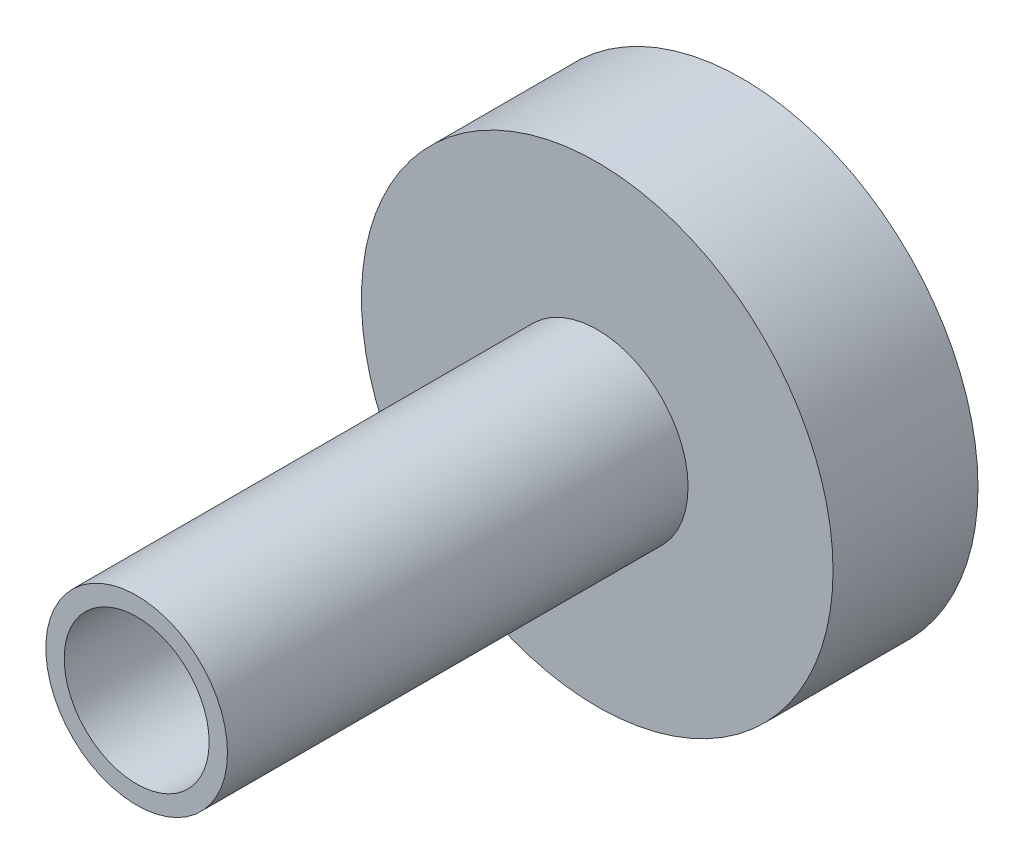
ISO-10303-21;
HEADER;
FILE_DESCRIPTION(('STEP AP214'),'2;1');
FILE_NAME('part.step','',(''),(''),'','','');
FILE_SCHEMA(('AUTOMOTIVE_DESIGN { 1 0 10303 214 1 1 1 1 }'));
ENDSEC;
DATA;
#1=APPLICATION_CONTEXT('core data for automotive mechanical design processes');
#2=APPLICATION_PROTOCOL_DEFINITION('international standard','automotive_design',2000,#1);
#3=PRODUCT_CONTEXT('',#1,'mechanical');
#4=PRODUCT('Part','Part','',(#3));
#5=PRODUCT_RELATED_PRODUCT_CATEGORY('part','',(#4));
#6=PRODUCT_DEFINITION_FORMATION('','',#4);
#7=PRODUCT_DEFINITION_CONTEXT('part definition',#1,'design');
#8=PRODUCT_DEFINITION('design','',#6,#7);
#9=PRODUCT_DEFINITION_SHAPE('','',#8);
#10=(LENGTH_UNIT() NAMED_UNIT(*) SI_UNIT(.MILLI.,.METRE.));
#11=(NAMED_UNIT(*) PLANE_ANGLE_UNIT() SI_UNIT($,.RADIAN.));
#12=(NAMED_UNIT(*) SI_UNIT($,.STERADIAN.) SOLID_ANGLE_UNIT());
#13=UNCERTAINTY_MEASURE_WITH_UNIT(LENGTH_MEASURE(1.E-05),#10,'distance_accuracy_value','');
#14=(GEOMETRIC_REPRESENTATION_CONTEXT(3) GLOBAL_UNCERTAINTY_ASSIGNED_CONTEXT((#13)) GLOBAL_UNIT_ASSIGNED_CONTEXT((#10,
#11,#12)) REPRESENTATION_CONTEXT('',''));
#15=CARTESIAN_POINT('',(0.,0.,0.));
#16=DIRECTION('',(0.,0.,1.));
#17=DIRECTION('',(1.,0.,0.));
#18=AXIS2_PLACEMENT_3D('',#15,#16,#17);
#19=CARTESIAN_POINT('',(0.,0.,33.));
#20=DIRECTION('',(0.,0.,1.));
#21=DIRECTION('',(1.,0.,0.));
#22=AXIS2_PLACEMENT_3D('',#19,#20,#21);
#23=PLANE('',#22);
#24=CARTESIAN_POINT('',(0.,0.,33.));
#25=DIRECTION('',(0.,0.,1.));
#26=DIRECTION('',(1.,0.,0.));
#27=AXIS2_PLACEMENT_3D('',#24,#25,#26);
#28=CIRCLE('',#27,3.95);
#29=CARTESIAN_POINT('',(3.95,0.,33.));
#30=VERTEX_POINT('',#29);
#31=EDGE_CURVE('E38',#30,#30,#28,.T.);
#32=ORIENTED_EDGE('',*,*,#31,.F.);
#33=EDGE_LOOP('',(#32));
#34=FACE_BOUND('',#33,.T.);
#35=CARTESIAN_POINT('',(0.,0.,33.));
#36=DIRECTION('',(0.,0.,1.));
#37=DIRECTION('',(1.,0.,0.));
#38=AXIS2_PLACEMENT_3D('',#35,#36,#37);
#39=CIRCLE('',#38,4.95);
#40=CARTESIAN_POINT('',(4.95,0.,33.));
#41=VERTEX_POINT('',#40);
#42=EDGE_CURVE('E52',#41,#41,#39,.T.);
#43=ORIENTED_EDGE('',*,*,#42,.T.);
#44=EDGE_LOOP('',(#43));
#45=FACE_BOUND('',#44,.T.);
#46=ADVANCED_FACE('F31',(#34,#45),#23,.T.);
#47=CARTESIAN_POINT('',(0.,0.,33.));
#48=DIRECTION('',(0.,0.,-1.));
#49=DIRECTION('',(-1.,0.,0.));
#50=AXIS2_PLACEMENT_3D('',#47,#48,#49);
#51=CYLINDRICAL_SURFACE('',#50,12.85);
#52=CARTESIAN_POINT('',(0.,0.,0.));
#53=DIRECTION('',(0.,0.,1.));
#54=DIRECTION('',(1.,0.,0.));
#55=AXIS2_PLACEMENT_3D('',#52,#53,#54);
#56=CIRCLE('',#55,12.85);
#57=CARTESIAN_POINT('',(12.85,0.,0.));
#58=VERTEX_POINT('',#57);
#59=EDGE_CURVE('E10',#58,#58,#56,.T.);
#60=ORIENTED_EDGE('',*,*,#59,.T.);
#61=EDGE_LOOP('',(#60));
#62=FACE_BOUND('',#61,.T.);
#63=CARTESIAN_POINT('',(0.,0.,7.9));
#64=DIRECTION('',(0.,0.,1.));
#65=DIRECTION('',(1.,0.,0.));
#66=AXIS2_PLACEMENT_3D('',#63,#64,#65);
#67=CIRCLE('',#66,12.85);
#68=CARTESIAN_POINT('',(12.85,0.,7.9));
#69=VERTEX_POINT('',#68);
#70=EDGE_CURVE('E47',#69,#69,#67,.T.);
#71=ORIENTED_EDGE('',*,*,#70,.F.);
#72=EDGE_LOOP('',(#71));
#73=FACE_BOUND('',#72,.T.);
#74=ADVANCED_FACE('F33',(#62,#73),#51,.T.);
#75=CARTESIAN_POINT('',(0.,0.,0.));
#76=DIRECTION('',(0.,0.,1.));
#77=DIRECTION('',(1.,0.,0.));
#78=AXIS2_PLACEMENT_3D('',#75,#76,#77);
#79=PLANE('',#78);
#80=ORIENTED_EDGE('',*,*,#59,.F.);
#81=EDGE_LOOP('',(#80));
#82=FACE_BOUND('',#81,.T.);
#83=CARTESIAN_POINT('',(0.,0.,0.));
#84=DIRECTION('',(0.,0.,1.));
#85=DIRECTION('',(1.,0.,0.));
#86=AXIS2_PLACEMENT_3D('',#83,#84,#85);
#87=CIRCLE('',#86,3.95);
#88=CARTESIAN_POINT('',(3.95,0.,0.));
#89=VERTEX_POINT('',#88);
#90=EDGE_CURVE('E42',#89,#89,#87,.T.);
#91=ORIENTED_EDGE('',*,*,#90,.T.);
#92=EDGE_LOOP('',(#91));
#93=FACE_BOUND('',#92,.T.);
#94=ADVANCED_FACE('F69',(#82,#93),#79,.F.);
#95=CARTESIAN_POINT('',(0.,0.,33.));
#96=DIRECTION('',(0.,0.,-1.));
#97=DIRECTION('',(-1.,0.,0.));
#98=AXIS2_PLACEMENT_3D('',#95,#96,#97);
#99=CYLINDRICAL_SURFACE('',#98,3.95);
#100=ORIENTED_EDGE('',*,*,#31,.T.);
#101=EDGE_LOOP('',(#100));
#102=FACE_BOUND('',#101,.T.);
#103=ORIENTED_EDGE('',*,*,#90,.F.);
#104=EDGE_LOOP('',(#103));
#105=FACE_BOUND('',#104,.T.);
#106=ADVANCED_FACE('F64',(#102,#105),#99,.F.);
#107=CARTESIAN_POINT('',(0.,0.,7.9));
#108=DIRECTION('',(0.,0.,1.));
#109=DIRECTION('',(1.,0.,0.));
#110=AXIS2_PLACEMENT_3D('',#107,#108,#109);
#111=PLANE('',#110);
#112=CARTESIAN_POINT('',(0.,0.,7.9));
#113=DIRECTION('',(0.,0.,1.));
#114=DIRECTION('',(1.,0.,0.));
#115=AXIS2_PLACEMENT_3D('',#112,#113,#114);
#116=CIRCLE('',#115,4.95);
#117=CARTESIAN_POINT('',(4.95,0.,7.9));
#118=VERTEX_POINT('',#117);
#119=EDGE_CURVE('E51',#118,#118,#116,.T.);
#120=ORIENTED_EDGE('',*,*,#119,.F.);
#121=EDGE_LOOP('',(#120));
#122=FACE_BOUND('',#121,.T.);
#123=ORIENTED_EDGE('',*,*,#70,.T.);
#124=EDGE_LOOP('',(#123));
#125=FACE_BOUND('',#124,.T.);
#126=ADVANCED_FACE('F61',(#122,#125),#111,.T.);
#127=CARTESIAN_POINT('',(0.,0.,7.9));
#128=DIRECTION('',(0.,0.,1.));
#129=DIRECTION('',(1.,0.,0.));
#130=AXIS2_PLACEMENT_3D('',#127,#128,#129);
#131=CYLINDRICAL_SURFACE('',#130,4.95);
#132=ORIENTED_EDGE('',*,*,#119,.T.);
#133=EDGE_LOOP('',(#132));
#134=FACE_BOUND('',#133,.T.);
#135=ORIENTED_EDGE('',*,*,#42,.F.);
#136=EDGE_LOOP('',(#135));
#137=FACE_BOUND('',#136,.T.);
#138=ADVANCED_FACE('F58',(#134,#137),#131,.T.);
#139=CLOSED_SHELL('',(#46,#74,#94,#106,#126,#138));
#140=MANIFOLD_SOLID_BREP('B2',#139);
#141=ADVANCED_BREP_SHAPE_REPRESENTATION('',(#18,#140),#14);
#142=SHAPE_DEFINITION_REPRESENTATION(#9,#141);
ENDSEC;
END-ISO-10303-21;
